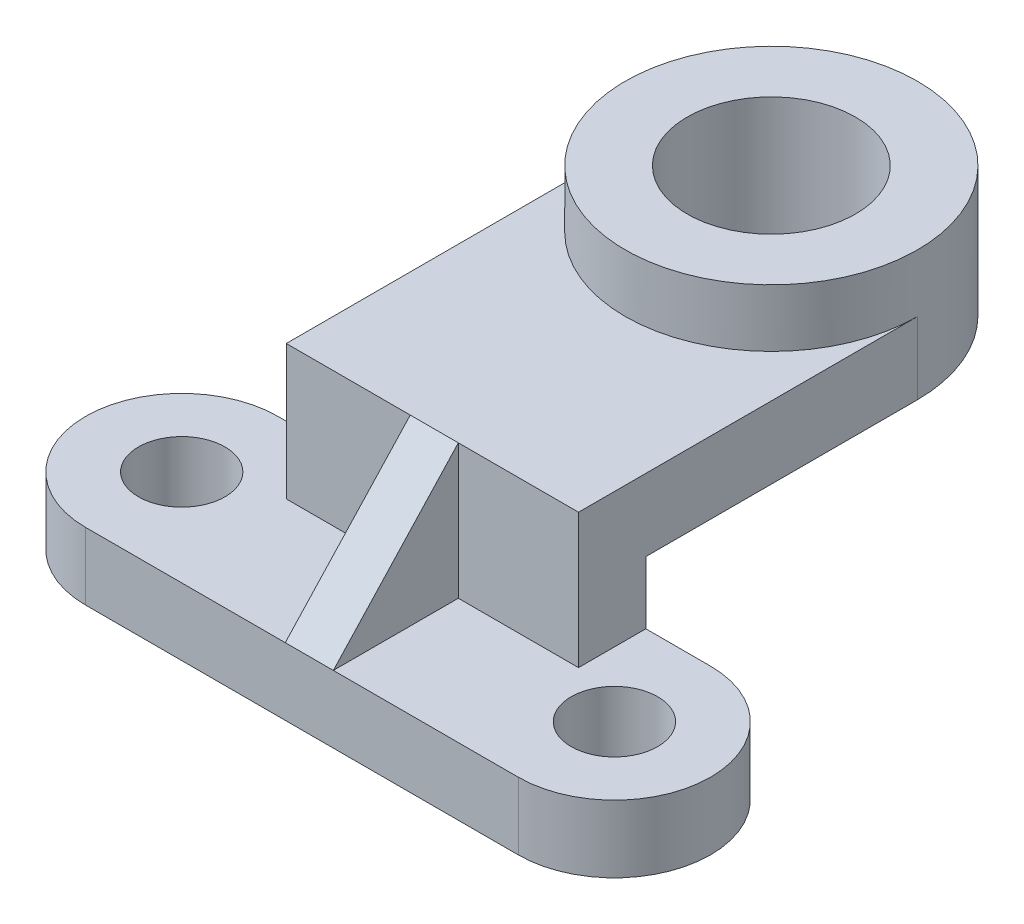
ISO-10303-21;
HEADER;
FILE_DESCRIPTION(('STEP AP214'),'2;1');
FILE_NAME('part.step','',(''),(''),'','','');
FILE_SCHEMA(('AUTOMOTIVE_DESIGN { 1 0 10303 214 1 1 1 1 }'));
ENDSEC;
DATA;
#1=APPLICATION_CONTEXT('core data for automotive mechanical design processes');
#2=APPLICATION_PROTOCOL_DEFINITION('international standard','automotive_design',2000,#1);
#3=PRODUCT_CONTEXT('',#1,'mechanical');
#4=PRODUCT('Part','Part','',(#3));
#5=PRODUCT_RELATED_PRODUCT_CATEGORY('part','',(#4));
#6=PRODUCT_DEFINITION_FORMATION('','',#4);
#7=PRODUCT_DEFINITION_CONTEXT('part definition',#1,'design');
#8=PRODUCT_DEFINITION('design','',#6,#7);
#9=PRODUCT_DEFINITION_SHAPE('','',#8);
#10=(LENGTH_UNIT() NAMED_UNIT(*) SI_UNIT(.MILLI.,.METRE.));
#11=(NAMED_UNIT(*) PLANE_ANGLE_UNIT() SI_UNIT($,.RADIAN.));
#12=(NAMED_UNIT(*) SI_UNIT($,.STERADIAN.) SOLID_ANGLE_UNIT());
#13=UNCERTAINTY_MEASURE_WITH_UNIT(LENGTH_MEASURE(1.E-05),#10,'distance_accuracy_value','');
#14=(GEOMETRIC_REPRESENTATION_CONTEXT(3) GLOBAL_UNCERTAINTY_ASSIGNED_CONTEXT((#13)) GLOBAL_UNIT_ASSIGNED_CONTEXT((#10,
#11,#12)) REPRESENTATION_CONTEXT('',''));
#15=CARTESIAN_POINT('',(0.,0.,0.));
#16=DIRECTION('',(0.,0.,1.));
#17=DIRECTION('',(1.,0.,0.));
#18=AXIS2_PLACEMENT_3D('',#15,#16,#17);
#19=CARTESIAN_POINT('',(-48.732108462569,28.,74.9807199490866));
#20=DIRECTION('',(0.,1.,0.));
#21=DIRECTION('',(0.,0.,1.));
#22=AXIS2_PLACEMENT_3D('',#19,#20,#21);
#23=PLANE('',#22);
#24=CARTESIAN_POINT('',(-48.732108462569,28.,74.9807199490866));
#25=DIRECTION('',(0.,1.,0.));
#26=DIRECTION('',(0.,0.,1.));
#27=AXIS2_PLACEMENT_3D('',#24,#25,#26);
#28=CIRCLE('',#27,18.);
#29=CARTESIAN_POINT('',(-48.732108462569,28.,92.9807199490866));
#30=VERTEX_POINT('',#29);
#31=EDGE_CURVE('E202',#30,#30,#28,.T.);
#32=ORIENTED_EDGE('',*,*,#31,.F.);
#33=EDGE_LOOP('',(#32));
#34=FACE_BOUND('',#33,.T.);
#35=DIRECTION('',(1.,0.,0.));
#36=VECTOR('',#35,1.);
#37=CARTESIAN_POINT('',(-48.732108462569,28.,114.980719949087));
#38=LINE('',#37,#36);
#39=CARTESIAN_POINT('',(-48.732108462569,28.,114.980719949087));
#40=VERTEX_POINT('',#39);
#41=CARTESIAN_POINT('',(34.3361797524451,28.,114.980719949087));
#42=VERTEX_POINT('',#41);
#43=EDGE_CURVE('E216',#40,#42,#38,.T.);
#44=ORIENTED_EDGE('',*,*,#43,.T.);
#45=DIRECTION('',(0.,0.,-1.));
#46=VECTOR('',#45,1.);
#47=CARTESIAN_POINT('',(34.3361797524451,28.,114.980719949087));
#48=LINE('',#47,#46);
#49=CARTESIAN_POINT('',(34.3361797524451,28.,62.9807199490866));
#50=VERTEX_POINT('',#49);
#51=EDGE_CURVE('E328',#42,#50,#48,.T.);
#52=ORIENTED_EDGE('',*,*,#51,.T.);
#53=DIRECTION('',(1.,0.,0.));
#54=VECTOR('',#53,1.);
#55=CARTESIAN_POINT('',(104.336179752445,28.,62.9807199490866));
#56=LINE('',#55,#54);
#57=CARTESIAN_POINT('',(-17.2412433126422,28.,62.9807199490866));
#58=VERTEX_POINT('',#57);
#59=EDGE_CURVE('E63',#58,#50,#56,.T.);
#60=ORIENTED_EDGE('',*,*,#59,.F.);
#61=DIRECTION('',(0.,0.,1.));
#62=VECTOR('',#61,1.);
#63=CARTESIAN_POINT('',(-17.2412433126422,28.,62.9807199490866));
#64=LINE('',#63,#62);
#65=CARTESIAN_POINT('',(-17.2412433126422,28.,34.9807199490866));
#66=VERTEX_POINT('',#65);
#67=EDGE_CURVE('E48',#66,#58,#64,.T.);
#68=ORIENTED_EDGE('',*,*,#67,.F.);
#69=DIRECTION('',(-1.,0.,0.));
#70=VECTOR('',#69,1.);
#71=CARTESIAN_POINT('',(-48.732108462569,28.,34.9807199490866));
#72=LINE('',#71,#70);
#73=CARTESIAN_POINT('',(-48.732108462569,28.,34.9807199490866));
#74=VERTEX_POINT('',#73);
#75=EDGE_CURVE('E223',#66,#74,#72,.T.);
#76=ORIENTED_EDGE('',*,*,#75,.T.);
#77=CARTESIAN_POINT('',(-48.732108462569,28.,74.9807199490866));
#78=DIRECTION('',(0.,1.,0.));
#79=DIRECTION('',(0.,0.,1.));
#80=AXIS2_PLACEMENT_3D('',#77,#78,#79);
#81=CIRCLE('',#80,40.);
#82=EDGE_CURVE('E210',#74,#40,#81,.T.);
#83=ORIENTED_EDGE('',*,*,#82,.T.);
#84=EDGE_LOOP('',(#44,#52,#60,#68,#76,#83));
#85=FACE_BOUND('',#84,.T.);
#86=ADVANCED_FACE('F39',(#34,#85),#23,.T.);
#87=CARTESIAN_POINT('',(104.336179752445,84.,62.9807199490866));
#88=DIRECTION('',(0.,0.,-1.));
#89=DIRECTION('',(-1.,0.,0.));
#90=AXIS2_PLACEMENT_3D('',#87,#88,#89);
#91=PLANE('',#90);
#92=DIRECTION('',(0.,1.,0.));
#93=VECTOR('',#92,1.);
#94=CARTESIAN_POINT('',(34.3361797524451,28.,62.9807199490866));
#95=LINE('',#94,#93);
#96=CARTESIAN_POINT('',(34.3361797524451,84.,62.9807199490866));
#97=VERTEX_POINT('',#96);
#98=EDGE_CURVE('E324',#50,#97,#95,.T.);
#99=ORIENTED_EDGE('',*,*,#98,.T.);
#100=DIRECTION('',(1.,0.,0.));
#101=VECTOR('',#100,1.);
#102=CARTESIAN_POINT('',(104.336179752445,84.,62.9807199490866));
#103=LINE('',#102,#101);
#104=CARTESIAN_POINT('',(-17.2412433126422,84.,62.9807199490866));
#105=VERTEX_POINT('',#104);
#106=EDGE_CURVE('E282',#105,#97,#103,.T.);
#107=ORIENTED_EDGE('',*,*,#106,.F.);
#108=DIRECTION('',(0.,-1.,0.));
#109=VECTOR('',#108,1.);
#110=CARTESIAN_POINT('',(-17.2412433126422,84.,62.9807199490866));
#111=LINE('',#110,#109);
#112=EDGE_CURVE('E178',#105,#58,#111,.T.);
#113=ORIENTED_EDGE('',*,*,#112,.T.);
#114=ORIENTED_EDGE('',*,*,#59,.T.);
#115=EDGE_LOOP('',(#99,#107,#113,#114));
#116=FACE_BOUND('',#115,.T.);
#117=ADVANCED_FACE('F335',(#116),#91,.F.);
#118=DIRECTION('',(0.,0.,-1.));
#119=VECTOR('',#118,1.);
#120=CARTESIAN_POINT('',(54.3361797524451,28.,114.980719949087));
#121=LINE('',#120,#119);
#122=CARTESIAN_POINT('',(54.3361797524451,28.,114.980719949087));
#123=VERTEX_POINT('',#122);
#124=CARTESIAN_POINT('',(54.3361797524451,28.,62.9807199490866));
#125=VERTEX_POINT('',#124);
#126=EDGE_CURVE('E136',#123,#125,#121,.T.);
#127=ORIENTED_EDGE('',*,*,#126,.F.);
#128=CARTESIAN_POINT('',(131.267891537431,28.,114.980719949087));
#129=VERTEX_POINT('',#128);
#130=EDGE_CURVE('E214',#123,#129,#38,.T.);
#131=ORIENTED_EDGE('',*,*,#130,.T.);
#132=CARTESIAN_POINT('',(131.267891537431,28.,74.9807199490866));
#133=DIRECTION('',(0.,1.,0.));
#134=DIRECTION('',(0.,0.,1.));
#135=AXIS2_PLACEMENT_3D('',#132,#133,#134);
#136=CIRCLE('',#135,40.);
#137=CARTESIAN_POINT('',(131.267891537431,28.,34.9807199490866));
#138=VERTEX_POINT('',#137);
#139=EDGE_CURVE('E220',#129,#138,#136,.T.);
#140=ORIENTED_EDGE('',*,*,#139,.T.);
#141=CARTESIAN_POINT('',(104.336179752445,28.,34.9807199490866));
#142=VERTEX_POINT('',#141);
#143=EDGE_CURVE('E224',#138,#142,#72,.T.);
#144=ORIENTED_EDGE('',*,*,#143,.T.);
#145=DIRECTION('',(0.,0.,-1.));
#146=VECTOR('',#145,1.);
#147=CARTESIAN_POINT('',(104.336179752445,28.,-78.0192800509134));
#148=LINE('',#147,#146);
#149=CARTESIAN_POINT('',(104.336179752445,28.,62.9807199490866));
#150=VERTEX_POINT('',#149);
#151=EDGE_CURVE('E160',#150,#142,#148,.T.);
#152=ORIENTED_EDGE('',*,*,#151,.F.);
#153=EDGE_CURVE('E150',#125,#150,#56,.T.);
#154=ORIENTED_EDGE('',*,*,#153,.F.);
#155=EDGE_LOOP('',(#127,#131,#140,#144,#152,#154));
#156=FACE_BOUND('',#155,.T.);
#157=CARTESIAN_POINT('',(131.267891537431,28.,74.9807199490866));
#158=DIRECTION('',(0.,1.,0.));
#159=DIRECTION('',(0.,0.,1.));
#160=AXIS2_PLACEMENT_3D('',#157,#158,#159);
#161=CIRCLE('',#160,18.);
#162=CARTESIAN_POINT('',(131.267891537431,28.,92.9807199490867));
#163=VERTEX_POINT('',#162);
#164=EDGE_CURVE('E194',#163,#163,#161,.T.);
#165=ORIENTED_EDGE('',*,*,#164,.F.);
#166=EDGE_LOOP('',(#165));
#167=FACE_BOUND('',#166,.T.);
#168=ADVANCED_FACE('F156',(#156,#167),#23,.T.);
#169=CARTESIAN_POINT('',(-48.732108462569,0.,74.9807199490866));
#170=DIRECTION('',(0.,1.,0.));
#171=DIRECTION('',(0.,0.,1.));
#172=AXIS2_PLACEMENT_3D('',#169,#170,#171);
#173=PLANE('',#172);
#174=CARTESIAN_POINT('',(-48.732108462569,0.,74.9807199490866));
#175=DIRECTION('',(0.,1.,0.));
#176=DIRECTION('',(0.,0.,1.));
#177=AXIS2_PLACEMENT_3D('',#174,#175,#176);
#178=CIRCLE('',#177,40.);
#179=CARTESIAN_POINT('',(-48.732108462569,0.,34.9807199490866));
#180=VERTEX_POINT('',#179);
#181=CARTESIAN_POINT('',(-48.732108462569,0.,114.980719949087));
#182=VERTEX_POINT('',#181);
#183=EDGE_CURVE('E206',#180,#182,#178,.T.);
#184=ORIENTED_EDGE('',*,*,#183,.F.);
#185=DIRECTION('',(-1.,0.,0.));
#186=VECTOR('',#185,1.);
#187=CARTESIAN_POINT('',(-48.732108462569,0.,34.9807199490866));
#188=LINE('',#187,#186);
#189=CARTESIAN_POINT('',(131.267891537431,0.,34.9807199490866));
#190=VERTEX_POINT('',#189);
#191=EDGE_CURVE('E215',#190,#180,#188,.T.);
#192=ORIENTED_EDGE('',*,*,#191,.F.);
#193=CARTESIAN_POINT('',(131.267891537431,0.,74.9807199490866));
#194=DIRECTION('',(0.,1.,0.));
#195=DIRECTION('',(0.,0.,1.));
#196=AXIS2_PLACEMENT_3D('',#193,#194,#195);
#197=CIRCLE('',#196,40.);
#198=CARTESIAN_POINT('',(131.267891537431,0.,114.980719949087));
#199=VERTEX_POINT('',#198);
#200=EDGE_CURVE('E234',#199,#190,#197,.T.);
#201=ORIENTED_EDGE('',*,*,#200,.F.);
#202=DIRECTION('',(1.,0.,0.));
#203=VECTOR('',#202,1.);
#204=CARTESIAN_POINT('',(-48.732108462569,0.,114.980719949087));
#205=LINE('',#204,#203);
#206=EDGE_CURVE('E231',#182,#199,#205,.T.);
#207=ORIENTED_EDGE('',*,*,#206,.F.);
#208=EDGE_LOOP('',(#184,#192,#201,#207));
#209=FACE_BOUND('',#208,.T.);
#210=CARTESIAN_POINT('',(-48.732108462569,0.,74.9807199490866));
#211=DIRECTION('',(0.,1.,0.));
#212=DIRECTION('',(0.,0.,1.));
#213=AXIS2_PLACEMENT_3D('',#210,#211,#212);
#214=CIRCLE('',#213,18.);
#215=CARTESIAN_POINT('',(-48.732108462569,0.,92.9807199490866));
#216=VERTEX_POINT('',#215);
#217=EDGE_CURVE('E198',#216,#216,#214,.T.);
#218=ORIENTED_EDGE('',*,*,#217,.T.);
#219=EDGE_LOOP('',(#218));
#220=FACE_BOUND('',#219,.T.);
#221=CARTESIAN_POINT('',(131.267891537431,0.,74.9807199490866));
#222=DIRECTION('',(0.,1.,0.));
#223=DIRECTION('',(0.,0.,1.));
#224=AXIS2_PLACEMENT_3D('',#221,#222,#223);
#225=CIRCLE('',#224,18.);
#226=CARTESIAN_POINT('',(131.267891537431,0.,92.9807199490867));
#227=VERTEX_POINT('',#226);
#228=EDGE_CURVE('E193',#227,#227,#225,.T.);
#229=ORIENTED_EDGE('',*,*,#228,.T.);
#230=EDGE_LOOP('',(#229));
#231=FACE_BOUND('',#230,.T.);
#232=ADVANCED_FACE('F262',(#209,#220,#231),#173,.F.);
#233=CARTESIAN_POINT('',(-48.732108462569,28.,74.9807199490866));
#234=DIRECTION('',(0.,-1.,0.));
#235=DIRECTION('',(0.,0.,-1.));
#236=AXIS2_PLACEMENT_3D('',#233,#234,#235);
#237=CYLINDRICAL_SURFACE('',#236,40.);
#238=ORIENTED_EDGE('',*,*,#183,.T.);
#239=DIRECTION('',(0.,-1.,0.));
#240=VECTOR('',#239,1.);
#241=CARTESIAN_POINT('',(-48.732108462569,28.,114.980719949087));
#242=LINE('',#241,#240);
#243=EDGE_CURVE('E177',#40,#182,#242,.T.);
#244=ORIENTED_EDGE('',*,*,#243,.F.);
#245=ORIENTED_EDGE('',*,*,#82,.F.);
#246=DIRECTION('',(0.,-1.,0.));
#247=VECTOR('',#246,1.);
#248=CARTESIAN_POINT('',(-48.732108462569,28.,34.9807199490866));
#249=LINE('',#248,#247);
#250=EDGE_CURVE('E227',#74,#180,#249,.T.);
#251=ORIENTED_EDGE('',*,*,#250,.T.);
#252=EDGE_LOOP('',(#238,#244,#245,#251));
#253=FACE_BOUND('',#252,.T.);
#254=ADVANCED_FACE('F41',(#253),#237,.T.);
#255=CARTESIAN_POINT('',(-48.732108462569,28.,114.980719949087));
#256=DIRECTION('',(0.,0.,-1.));
#257=DIRECTION('',(-1.,0.,0.));
#258=AXIS2_PLACEMENT_3D('',#255,#256,#257);
#259=PLANE('',#258);
#260=ORIENTED_EDGE('',*,*,#206,.T.);
#261=DIRECTION('',(0.,-1.,0.));
#262=VECTOR('',#261,1.);
#263=CARTESIAN_POINT('',(131.267891537431,28.,114.980719949087));
#264=LINE('',#263,#262);
#265=EDGE_CURVE('E246',#129,#199,#264,.T.);
#266=ORIENTED_EDGE('',*,*,#265,.F.);
#267=ORIENTED_EDGE('',*,*,#130,.F.);
#268=DIRECTION('',(-1.,0.,0.));
#269=VECTOR('',#268,1.);
#270=CARTESIAN_POINT('',(54.3361797524451,28.,114.980719949087));
#271=LINE('',#270,#269);
#272=EDGE_CURVE('E318',#123,#42,#271,.T.);
#273=ORIENTED_EDGE('',*,*,#272,.T.);
#274=ORIENTED_EDGE('',*,*,#43,.F.);
#275=ORIENTED_EDGE('',*,*,#243,.T.);
#276=EDGE_LOOP('',(#260,#266,#267,#273,#274,#275));
#277=FACE_BOUND('',#276,.T.);
#278=ADVANCED_FACE('F253',(#277),#259,.F.);
#279=CARTESIAN_POINT('',(131.267891537431,28.,74.9807199490866));
#280=DIRECTION('',(0.,-1.,0.));
#281=DIRECTION('',(0.,0.,-1.));
#282=AXIS2_PLACEMENT_3D('',#279,#280,#281);
#283=CYLINDRICAL_SURFACE('',#282,40.);
#284=ORIENTED_EDGE('',*,*,#200,.T.);
#285=DIRECTION('',(0.,-1.,0.));
#286=VECTOR('',#285,1.);
#287=CARTESIAN_POINT('',(131.267891537431,28.,34.9807199490866));
#288=LINE('',#287,#286);
#289=EDGE_CURVE('E242',#138,#190,#288,.T.);
#290=ORIENTED_EDGE('',*,*,#289,.F.);
#291=ORIENTED_EDGE('',*,*,#139,.F.);
#292=ORIENTED_EDGE('',*,*,#265,.T.);
#293=EDGE_LOOP('',(#284,#290,#291,#292));
#294=FACE_BOUND('',#293,.T.);
#295=ADVANCED_FACE('F267',(#294),#283,.T.);
#296=CARTESIAN_POINT('',(-48.732108462569,28.,34.9807199490866));
#297=DIRECTION('',(0.,0.,1.));
#298=DIRECTION('',(1.,0.,0.));
#299=AXIS2_PLACEMENT_3D('',#296,#297,#298);
#300=PLANE('',#299);
#301=ORIENTED_EDGE('',*,*,#191,.T.);
#302=ORIENTED_EDGE('',*,*,#250,.F.);
#303=ORIENTED_EDGE('',*,*,#75,.F.);
#304=DIRECTION('',(0.,-1.,0.));
#305=VECTOR('',#304,1.);
#306=CARTESIAN_POINT('',(-17.2412433126422,84.,34.9807199490866));
#307=LINE('',#306,#305);
#308=CARTESIAN_POINT('',(-17.2412433126422,54.,34.9807199490866));
#309=VERTEX_POINT('',#308);
#310=EDGE_CURVE('E163',#309,#66,#307,.T.);
#311=ORIENTED_EDGE('',*,*,#310,.F.);
#312=DIRECTION('',(1.,0.,0.));
#313=VECTOR('',#312,1.);
#314=CARTESIAN_POINT('',(-75.6638202475549,54.,34.9807199490866));
#315=LINE('',#314,#313);
#316=CARTESIAN_POINT('',(104.336179752445,54.,34.9807199490866));
#317=VERTEX_POINT('',#316);
#318=EDGE_CURVE('E167',#309,#317,#315,.T.);
#319=ORIENTED_EDGE('',*,*,#318,.T.);
#320=DIRECTION('',(0.,-1.,0.));
#321=VECTOR('',#320,1.);
#322=CARTESIAN_POINT('',(104.336179752445,28.,34.9807199490866));
#323=LINE('',#322,#321);
#324=EDGE_CURVE('E273',#317,#142,#323,.T.);
#325=ORIENTED_EDGE('',*,*,#324,.T.);
#326=ORIENTED_EDGE('',*,*,#143,.F.);
#327=ORIENTED_EDGE('',*,*,#289,.T.);
#328=EDGE_LOOP('',(#301,#302,#303,#311,#319,#325,#326,#327));
#329=FACE_BOUND('',#328,.T.);
#330=ADVANCED_FACE('F271',(#329),#300,.F.);
#331=CARTESIAN_POINT('',(-48.732108462569,28.,74.9807199490866));
#332=DIRECTION('',(0.,-1.,0.));
#333=DIRECTION('',(0.,0.,-1.));
#334=AXIS2_PLACEMENT_3D('',#331,#332,#333);
#335=CYLINDRICAL_SURFACE('',#334,18.);
#336=ORIENTED_EDGE('',*,*,#31,.T.);
#337=EDGE_LOOP('',(#336));
#338=FACE_BOUND('',#337,.T.);
#339=ORIENTED_EDGE('',*,*,#217,.F.);
#340=EDGE_LOOP('',(#339));
#341=FACE_BOUND('',#340,.T.);
#342=ADVANCED_FACE('F375',(#338,#341),#335,.F.);
#343=CARTESIAN_POINT('',(131.267891537431,28.,74.9807199490866));
#344=DIRECTION('',(0.,-1.,0.));
#345=DIRECTION('',(0.,0.,-1.));
#346=AXIS2_PLACEMENT_3D('',#343,#344,#345);
#347=CYLINDRICAL_SURFACE('',#346,18.);
#348=ORIENTED_EDGE('',*,*,#164,.T.);
#349=EDGE_LOOP('',(#348));
#350=FACE_BOUND('',#349,.T.);
#351=ORIENTED_EDGE('',*,*,#228,.F.);
#352=EDGE_LOOP('',(#351));
#353=FACE_BOUND('',#352,.T.);
#354=ADVANCED_FACE('F399',(#350,#353),#347,.F.);
#355=CARTESIAN_POINT('',(54.3361797524451,84.,62.9807199490866));
#356=VERTEX_POINT('',#355);
#357=CARTESIAN_POINT('',(104.336179752445,84.,62.9807199490866));
#358=VERTEX_POINT('',#357);
#359=EDGE_CURVE('E152',#356,#358,#103,.T.);
#360=ORIENTED_EDGE('',*,*,#359,.F.);
#361=DIRECTION('',(0.,1.,0.));
#362=VECTOR('',#361,1.);
#363=CARTESIAN_POINT('',(54.3361797524451,28.,62.9807199490866));
#364=LINE('',#363,#362);
#365=EDGE_CURVE('E139',#125,#356,#364,.T.);
#366=ORIENTED_EDGE('',*,*,#365,.F.);
#367=ORIENTED_EDGE('',*,*,#153,.T.);
#368=DIRECTION('',(0.,-1.,0.));
#369=VECTOR('',#368,1.);
#370=CARTESIAN_POINT('',(104.336179752445,84.,62.9807199490866));
#371=LINE('',#370,#369);
#372=EDGE_CURVE('E190',#358,#150,#371,.T.);
#373=ORIENTED_EDGE('',*,*,#372,.F.);
#374=EDGE_LOOP('',(#360,#366,#367,#373));
#375=FACE_BOUND('',#374,.T.);
#376=ADVANCED_FACE('F148',(#375),#91,.F.);
#377=CARTESIAN_POINT('',(104.336179752445,84.,-78.0192800509134));
#378=DIRECTION('',(-1.,0.,0.));
#379=DIRECTION('',(0.,0.,1.));
#380=AXIS2_PLACEMENT_3D('',#377,#378,#379);
#381=PLANE('',#380);
#382=ORIENTED_EDGE('',*,*,#151,.T.);
#383=ORIENTED_EDGE('',*,*,#324,.F.);
#384=DIRECTION('',(0.,0.,1.));
#385=VECTOR('',#384,1.);
#386=CARTESIAN_POINT('',(104.336179752445,54.,34.9807199490866));
#387=LINE('',#386,#385);
#388=CARTESIAN_POINT('',(104.336179752445,54.,-78.0192800509134));
#389=VERTEX_POINT('',#388);
#390=EDGE_CURVE('E290',#389,#317,#387,.T.);
#391=ORIENTED_EDGE('',*,*,#390,.F.);
#392=DIRECTION('',(0.,-1.,0.));
#393=VECTOR('',#392,1.);
#394=CARTESIAN_POINT('',(104.336179752445,84.,-78.0192800509134));
#395=LINE('',#394,#393);
#396=CARTESIAN_POINT('',(104.336179752445,84.,-78.0192800509134));
#397=VERTEX_POINT('',#396);
#398=EDGE_CURVE('E186',#397,#389,#395,.T.);
#399=ORIENTED_EDGE('',*,*,#398,.F.);
#400=DIRECTION('',(0.,0.,-1.));
#401=VECTOR('',#400,1.);
#402=CARTESIAN_POINT('',(104.336179752445,84.,-78.0192800509134));
#403=LINE('',#402,#401);
#404=EDGE_CURVE('E278',#358,#397,#403,.T.);
#405=ORIENTED_EDGE('',*,*,#404,.F.);
#406=ORIENTED_EDGE('',*,*,#372,.T.);
#407=EDGE_LOOP('',(#382,#383,#391,#399,#405,#406));
#408=FACE_BOUND('',#407,.T.);
#409=ADVANCED_FACE('F275',(#408),#381,.F.);
#410=CARTESIAN_POINT('',(-17.2412433126422,84.,62.9807199490866));
#411=DIRECTION('',(1.,0.,0.));
#412=DIRECTION('',(0.,0.,-1.));
#413=AXIS2_PLACEMENT_3D('',#410,#411,#412);
#414=PLANE('',#413);
#415=DIRECTION('',(0.,0.,1.));
#416=VECTOR('',#415,1.);
#417=CARTESIAN_POINT('',(-17.2412433126422,54.,62.9807199490866));
#418=LINE('',#417,#416);
#419=CARTESIAN_POINT('',(-17.2412433126422,54.,-78.0192800509134));
#420=VERTEX_POINT('',#419);
#421=EDGE_CURVE('E11',#420,#309,#418,.T.);
#422=ORIENTED_EDGE('',*,*,#421,.T.);
#423=ORIENTED_EDGE('',*,*,#310,.T.);
#424=ORIENTED_EDGE('',*,*,#67,.T.);
#425=ORIENTED_EDGE('',*,*,#112,.F.);
#426=DIRECTION('',(0.,0.,1.));
#427=VECTOR('',#426,1.);
#428=CARTESIAN_POINT('',(-17.2412433126422,84.,62.9807199490866));
#429=LINE('',#428,#427);
#430=CARTESIAN_POINT('',(-17.2412433126422,84.,-78.0192800509134));
#431=VERTEX_POINT('',#430);
#432=EDGE_CURVE('E171',#431,#105,#429,.T.);
#433=ORIENTED_EDGE('',*,*,#432,.F.);
#434=DIRECTION('',(0.,-1.,0.));
#435=VECTOR('',#434,1.);
#436=CARTESIAN_POINT('',(-17.2412433126422,84.,-78.0192800509134));
#437=LINE('',#436,#435);
#438=EDGE_CURVE('E182',#431,#420,#437,.T.);
#439=ORIENTED_EDGE('',*,*,#438,.T.);
#440=EDGE_LOOP('',(#422,#423,#424,#425,#433,#439));
#441=FACE_BOUND('',#440,.T.);
#442=ADVANCED_FACE('F340',(#441),#414,.F.);
#443=CARTESIAN_POINT('',(0.,84.,0.));
#444=DIRECTION('',(0.,-1.,0.));
#445=DIRECTION('',(0.,0.,-1.));
#446=AXIS2_PLACEMENT_3D('',#443,#444,#445);
#447=PLANE('',#446);
#448=ORIENTED_EDGE('',*,*,#404,.T.);
#449=CARTESIAN_POINT('',(43.5474682199015,84.,-78.0192800509134));
#450=DIRECTION('',(0.,-1.,0.));
#451=DIRECTION('',(0.,0.,-1.));
#452=AXIS2_PLACEMENT_3D('',#449,#450,#451);
#453=CIRCLE('',#452,60.7887115325436);
#454=EDGE_CURVE('E296',#397,#431,#453,.T.);
#455=ORIENTED_EDGE('',*,*,#454,.T.);
#456=ORIENTED_EDGE('',*,*,#432,.T.);
#457=ORIENTED_EDGE('',*,*,#106,.T.);
#458=DIRECTION('',(-1.,0.,0.));
#459=VECTOR('',#458,1.);
#460=CARTESIAN_POINT('',(54.3361797524451,84.,62.9807199490866));
#461=LINE('',#460,#459);
#462=EDGE_CURVE('E312',#356,#97,#461,.T.);
#463=ORIENTED_EDGE('',*,*,#462,.F.);
#464=ORIENTED_EDGE('',*,*,#359,.T.);
#465=EDGE_LOOP('',(#448,#455,#456,#457,#463,#464));
#466=FACE_BOUND('',#465,.T.);
#467=ADVANCED_FACE('F422',(#466),#447,.F.);
#468=CARTESIAN_POINT('',(-75.6638202475549,54.,34.9807199490866));
#469=DIRECTION('',(0.,1.,0.));
#470=DIRECTION('',(0.,0.,1.));
#471=AXIS2_PLACEMENT_3D('',#468,#469,#470);
#472=PLANE('',#471);
#473=CARTESIAN_POINT('',(43.5474682199015,54.,-78.0192800509134));
#474=DIRECTION('',(0.,-1.,0.));
#475=DIRECTION('',(0.,0.,-1.));
#476=AXIS2_PLACEMENT_3D('',#473,#474,#475);
#477=CIRCLE('',#476,35.);
#478=CARTESIAN_POINT('',(43.5474682199015,54.,-113.019280050913));
#479=VERTEX_POINT('',#478);
#480=EDGE_CURVE('E308',#479,#479,#477,.T.);
#481=ORIENTED_EDGE('',*,*,#480,.F.);
#482=EDGE_LOOP('',(#481));
#483=FACE_BOUND('',#482,.T.);
#484=ORIENTED_EDGE('',*,*,#421,.F.);
#485=CARTESIAN_POINT('',(43.5474682199015,54.,-78.0192800509134));
#486=DIRECTION('',(0.,-1.,0.));
#487=DIRECTION('',(0.,0.,-1.));
#488=AXIS2_PLACEMENT_3D('',#485,#486,#487);
#489=CIRCLE('',#488,60.7887115325436);
#490=EDGE_CURVE('E300',#420,#389,#489,.T.);
#491=ORIENTED_EDGE('',*,*,#490,.T.);
#492=ORIENTED_EDGE('',*,*,#390,.T.);
#493=ORIENTED_EDGE('',*,*,#318,.F.);
#494=EDGE_LOOP('',(#484,#491,#492,#493));
#495=FACE_BOUND('',#494,.T.);
#496=ADVANCED_FACE('F429',(#483,#495),#472,.F.);
#497=CARTESIAN_POINT('',(43.5474682199015,108.,-78.0192800509134));
#498=DIRECTION('',(0.,-1.,0.));
#499=DIRECTION('',(0.,0.,-1.));
#500=AXIS2_PLACEMENT_3D('',#497,#498,#499);
#501=CYLINDRICAL_SURFACE('',#500,60.7887115325436);
#502=CARTESIAN_POINT('',(43.5474682199015,108.,-78.0192800509134));
#503=DIRECTION('',(0.,-1.,0.));
#504=DIRECTION('',(0.,0.,-1.));
#505=AXIS2_PLACEMENT_3D('',#502,#503,#504);
#506=CIRCLE('',#505,60.7887115325436);
#507=CARTESIAN_POINT('',(43.5474682199015,108.,-138.807991583457));
#508=VERTEX_POINT('',#507);
#509=EDGE_CURVE('E299',#508,#508,#506,.T.);
#510=ORIENTED_EDGE('',*,*,#509,.T.);
#511=EDGE_LOOP('',(#510));
#512=FACE_BOUND('',#511,.T.);
#513=ORIENTED_EDGE('',*,*,#398,.T.);
#514=ORIENTED_EDGE('',*,*,#490,.F.);
#515=ORIENTED_EDGE('',*,*,#438,.F.);
#516=ORIENTED_EDGE('',*,*,#454,.F.);
#517=EDGE_LOOP('',(#513,#514,#515,#516));
#518=FACE_BOUND('',#517,.T.);
#519=ADVANCED_FACE('F437',(#512,#518),#501,.T.);
#520=CARTESIAN_POINT('',(43.5474682199015,108.,-78.0192800509134));
#521=DIRECTION('',(0.,-1.,0.));
#522=DIRECTION('',(0.,0.,-1.));
#523=AXIS2_PLACEMENT_3D('',#520,#521,#522);
#524=CYLINDRICAL_SURFACE('',#523,35.);
#525=ORIENTED_EDGE('',*,*,#480,.T.);
#526=EDGE_LOOP('',(#525));
#527=FACE_BOUND('',#526,.T.);
#528=CARTESIAN_POINT('',(43.5474682199015,108.,-78.0192800509134));
#529=DIRECTION('',(0.,-1.,0.));
#530=DIRECTION('',(0.,0.,-1.));
#531=AXIS2_PLACEMENT_3D('',#528,#529,#530);
#532=CIRCLE('',#531,35.);
#533=CARTESIAN_POINT('',(43.5474682199015,108.,-113.019280050913));
#534=VERTEX_POINT('',#533);
#535=EDGE_CURVE('E304',#534,#534,#532,.T.);
#536=ORIENTED_EDGE('',*,*,#535,.F.);
#537=EDGE_LOOP('',(#536));
#538=FACE_BOUND('',#537,.T.);
#539=ADVANCED_FACE('F445',(#527,#538),#524,.F.);
#540=CARTESIAN_POINT('',(43.5474682199015,108.,-78.0192800509134));
#541=DIRECTION('',(0.,-1.,0.));
#542=DIRECTION('',(0.,0.,-1.));
#543=AXIS2_PLACEMENT_3D('',#540,#541,#542);
#544=PLANE('',#543);
#545=ORIENTED_EDGE('',*,*,#535,.T.);
#546=EDGE_LOOP('',(#545));
#547=FACE_BOUND('',#546,.T.);
#548=ORIENTED_EDGE('',*,*,#509,.F.);
#549=EDGE_LOOP('',(#548));
#550=FACE_BOUND('',#549,.T.);
#551=ADVANCED_FACE('F453',(#547,#550),#544,.F.);
#552=CARTESIAN_POINT('',(54.3361797524451,28.,114.980719949087));
#553=DIRECTION('',(0.,0.680451099367278,0.732793491626299));
#554=DIRECTION('',(0.,-0.732793491626299,0.680451099367278));
#555=AXIS2_PLACEMENT_3D('',#552,#553,#554);
#556=PLANE('',#555);
#557=DIRECTION('',(0.,0.732793491626299,-0.680451099367278));
#558=VECTOR('',#557,1.);
#559=CARTESIAN_POINT('',(34.3361797524451,28.,114.980719949087));
#560=LINE('',#559,#558);
#561=EDGE_CURVE('E145',#42,#97,#560,.T.);
#562=ORIENTED_EDGE('',*,*,#561,.F.);
#563=ORIENTED_EDGE('',*,*,#272,.F.);
#564=DIRECTION('',(0.,0.732793491626299,-0.680451099367278));
#565=VECTOR('',#564,1.);
#566=CARTESIAN_POINT('',(54.3361797524451,28.,114.980719949087));
#567=LINE('',#566,#565);
#568=EDGE_CURVE('E55',#123,#356,#567,.T.);
#569=ORIENTED_EDGE('',*,*,#568,.T.);
#570=ORIENTED_EDGE('',*,*,#462,.T.);
#571=EDGE_LOOP('',(#562,#563,#569,#570));
#572=FACE_BOUND('',#571,.T.);
#573=ADVANCED_FACE('F346',(#572),#556,.T.);
#574=CARTESIAN_POINT('',(54.3361797524451,0.,0.));
#575=DIRECTION('',(1.,0.,0.));
#576=DIRECTION('',(0.,0.,-1.));
#577=AXIS2_PLACEMENT_3D('',#574,#575,#576);
#578=PLANE('',#577);
#579=ORIENTED_EDGE('',*,*,#126,.T.);
#580=ORIENTED_EDGE('',*,*,#365,.T.);
#581=ORIENTED_EDGE('',*,*,#568,.F.);
#582=EDGE_LOOP('',(#579,#580,#581));
#583=FACE_BOUND('',#582,.T.);
#584=ADVANCED_FACE('F138',(#583),#578,.T.);
#585=CARTESIAN_POINT('',(34.3361797524451,0.,0.));
#586=DIRECTION('',(1.,0.,0.));
#587=DIRECTION('',(0.,0.,-1.));
#588=AXIS2_PLACEMENT_3D('',#585,#586,#587);
#589=PLANE('',#588);
#590=ORIENTED_EDGE('',*,*,#51,.F.);
#591=ORIENTED_EDGE('',*,*,#561,.T.);
#592=ORIENTED_EDGE('',*,*,#98,.F.);
#593=EDGE_LOOP('',(#590,#591,#592));
#594=FACE_BOUND('',#593,.T.);
#595=ADVANCED_FACE('F347',(#594),#589,.F.);
#596=CLOSED_SHELL('',(#86,#117,#168,#232,#254,#278,#295,#330,#342,#354,#376,#409,#442,#467,#496,
#519,#539,#551,#573,#584,#595));
#597=MANIFOLD_SOLID_BREP('B2',#596);
#598=ADVANCED_BREP_SHAPE_REPRESENTATION('',(#18,#597),#14);
#599=SHAPE_DEFINITION_REPRESENTATION(#9,#598);
ENDSEC;
END-ISO-10303-21;
